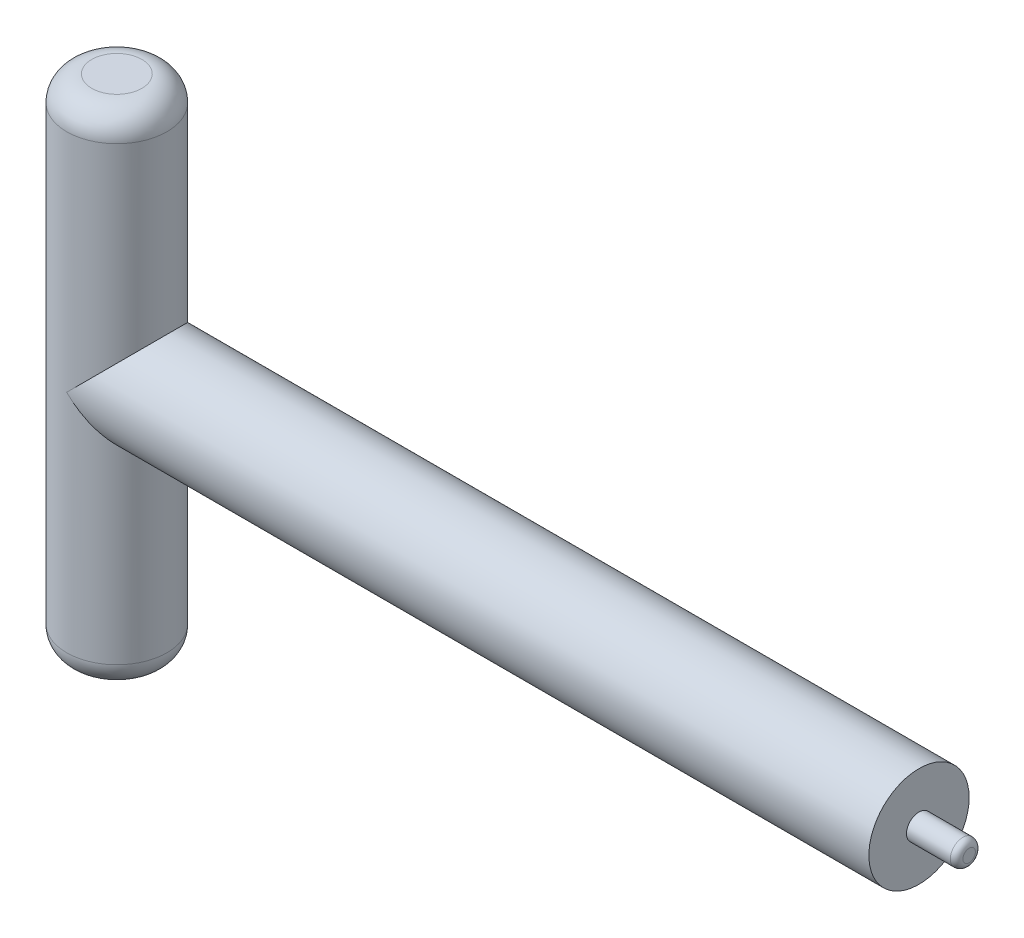
ISO-10303-21;
HEADER;
FILE_DESCRIPTION(('STEP AP214'),'2;1');
FILE_NAME('part.step','',(''),(''),'','','');
FILE_SCHEMA(('AUTOMOTIVE_DESIGN { 1 0 10303 214 1 1 1 1 }'));
ENDSEC;
DATA;
#1=APPLICATION_CONTEXT('core data for automotive mechanical design processes');
#2=APPLICATION_PROTOCOL_DEFINITION('international standard','automotive_design',2000,#1);
#3=PRODUCT_CONTEXT('',#1,'mechanical');
#4=PRODUCT('Part','Part','',(#3));
#5=PRODUCT_RELATED_PRODUCT_CATEGORY('part','',(#4));
#6=PRODUCT_DEFINITION_FORMATION('','',#4);
#7=PRODUCT_DEFINITION_CONTEXT('part definition',#1,'design');
#8=PRODUCT_DEFINITION('design','',#6,#7);
#9=PRODUCT_DEFINITION_SHAPE('','',#8);
#10=(LENGTH_UNIT() NAMED_UNIT(*) SI_UNIT(.MILLI.,.METRE.));
#11=(NAMED_UNIT(*) PLANE_ANGLE_UNIT() SI_UNIT($,.RADIAN.));
#12=(NAMED_UNIT(*) SI_UNIT($,.STERADIAN.) SOLID_ANGLE_UNIT());
#13=UNCERTAINTY_MEASURE_WITH_UNIT(LENGTH_MEASURE(1.E-05),#10,'distance_accuracy_value','');
#14=(GEOMETRIC_REPRESENTATION_CONTEXT(3) GLOBAL_UNCERTAINTY_ASSIGNED_CONTEXT((#13)) GLOBAL_UNIT_ASSIGNED_CONTEXT((#10,
#11,#12)) REPRESENTATION_CONTEXT('',''));
#15=CARTESIAN_POINT('',(0.,0.,0.));
#16=DIRECTION('',(0.,0.,1.));
#17=DIRECTION('',(1.,0.,0.));
#18=AXIS2_PLACEMENT_3D('',#15,#16,#17);
#19=CARTESIAN_POINT('',(203.2,0.,0.));
#20=DIRECTION('',(-1.,0.,0.));
#21=DIRECTION('',(0.,0.,1.));
#22=AXIS2_PLACEMENT_3D('',#19,#20,#21);
#23=CYLINDRICAL_SURFACE('',#22,12.7);
#24=CARTESIAN_POINT('',(203.2,0.,0.));
#25=DIRECTION('',(1.,0.,0.));
#26=DIRECTION('',(0.,0.,-1.));
#27=AXIS2_PLACEMENT_3D('',#24,#25,#26);
#28=CIRCLE('',#27,12.7);
#29=CARTESIAN_POINT('',(203.2,0.,-12.7));
#30=VERTEX_POINT('',#29);
#31=EDGE_CURVE('E59',#30,#30,#28,.T.);
#32=ORIENTED_EDGE('',*,*,#31,.F.);
#33=EDGE_LOOP('',(#32));
#34=FACE_BOUND('',#33,.T.);
#35=CARTESIAN_POINT('',(0.,0.,0.));
#36=DIRECTION('',(-0.707106781186547,-0.707106781186547,0.));
#37=DIRECTION('',(-0.707106781186547,0.707106781186547,0.));
#38=AXIS2_PLACEMENT_3D('',#35,#36,#37);
#39=ELLIPSE('',#38,17.9605122421383,12.7);
#40=CARTESIAN_POINT('',(0.,0.,12.7));
#41=VERTEX_POINT('',#40);
#42=CARTESIAN_POINT('',(0.,0.,-12.7));
#43=VERTEX_POINT('',#42);
#44=EDGE_CURVE('E55',#41,#43,#39,.F.);
#45=ORIENTED_EDGE('',*,*,#44,.T.);
#46=CARTESIAN_POINT('',(0.,0.,0.));
#47=DIRECTION('',(-0.707106781186547,0.707106781186547,0.));
#48=DIRECTION('',(-0.707106781186547,-0.707106781186547,0.));
#49=AXIS2_PLACEMENT_3D('',#46,#47,#48);
#50=ELLIPSE('',#49,17.9605122421383,12.7);
#51=EDGE_CURVE('E53',#43,#41,#50,.F.);
#52=ORIENTED_EDGE('',*,*,#51,.T.);
#53=EDGE_LOOP('',(#45,#52));
#54=FACE_BOUND('',#53,.T.);
#55=ADVANCED_FACE('F39',(#34,#54),#23,.T.);
#56=CARTESIAN_POINT('',(203.2,0.,0.));
#57=DIRECTION('',(1.,0.,0.));
#58=DIRECTION('',(0.,0.,-1.));
#59=AXIS2_PLACEMENT_3D('',#56,#57,#58);
#60=PLANE('',#59);
#61=CARTESIAN_POINT('',(203.2,0.,0.));
#62=DIRECTION('',(1.,0.,0.));
#63=DIRECTION('',(0.,0.,-1.));
#64=AXIS2_PLACEMENT_3D('',#61,#62,#63);
#65=CIRCLE('',#64,3.175);
#66=CARTESIAN_POINT('',(203.2,0.,-3.175));
#67=VERTEX_POINT('',#66);
#68=EDGE_CURVE('E62',#67,#67,#65,.T.);
#69=ORIENTED_EDGE('',*,*,#68,.F.);
#70=EDGE_LOOP('',(#69));
#71=FACE_BOUND('',#70,.T.);
#72=ORIENTED_EDGE('',*,*,#31,.T.);
#73=EDGE_LOOP('',(#72));
#74=FACE_BOUND('',#73,.T.);
#75=ADVANCED_FACE('F98',(#71,#74),#60,.T.);
#76=CARTESIAN_POINT('',(215.9,0.,0.));
#77=DIRECTION('',(-1.,0.,0.));
#78=DIRECTION('',(0.,0.,1.));
#79=AXIS2_PLACEMENT_3D('',#76,#77,#78);
#80=CYLINDRICAL_SURFACE('',#79,3.175);
#81=CARTESIAN_POINT('',(214.3125,0.,0.));
#82=DIRECTION('',(1.,0.,0.));
#83=DIRECTION('',(0.,0.,-1.));
#84=AXIS2_PLACEMENT_3D('',#81,#82,#83);
#85=CIRCLE('',#84,3.175);
#86=CARTESIAN_POINT('',(214.3125,0.,-3.175));
#87=VERTEX_POINT('',#86);
#88=EDGE_CURVE('E70',#87,#87,#85,.F.);
#89=ORIENTED_EDGE('',*,*,#88,.T.);
#90=EDGE_LOOP('',(#89));
#91=FACE_BOUND('',#90,.T.);
#92=ORIENTED_EDGE('',*,*,#68,.T.);
#93=EDGE_LOOP('',(#92));
#94=FACE_BOUND('',#93,.T.);
#95=ADVANCED_FACE('F106',(#91,#94),#80,.T.);
#96=CARTESIAN_POINT('',(215.9,0.,0.));
#97=DIRECTION('',(1.,0.,0.));
#98=DIRECTION('',(0.,0.,-1.));
#99=AXIS2_PLACEMENT_3D('',#96,#97,#98);
#100=PLANE('',#99);
#101=CARTESIAN_POINT('',(215.9,0.,0.));
#102=DIRECTION('',(1.,0.,0.));
#103=DIRECTION('',(0.,0.,-1.));
#104=AXIS2_PLACEMENT_3D('',#101,#102,#103);
#105=CIRCLE('',#104,1.5875);
#106=CARTESIAN_POINT('',(215.9,0.,-1.5875));
#107=VERTEX_POINT('',#106);
#108=EDGE_CURVE('E66',#107,#107,#105,.T.);
#109=ORIENTED_EDGE('',*,*,#108,.T.);
#110=EDGE_LOOP('',(#109));
#111=FACE_BOUND('',#110,.T.);
#112=ADVANCED_FACE('F113',(#111),#100,.T.);
#113=CARTESIAN_POINT('',(214.3125,0.,0.));
#114=DIRECTION('',(1.,0.,0.));
#115=DIRECTION('',(0.,0.,-1.));
#116=AXIS2_PLACEMENT_3D('',#113,#114,#115);
#117=DEGENERATE_TOROIDAL_SURFACE('',#116,1.5875,1.5875,.T.);
#118=ORIENTED_EDGE('',*,*,#88,.F.);
#119=EDGE_LOOP('',(#118));
#120=FACE_BOUND('',#119,.T.);
#121=ORIENTED_EDGE('',*,*,#108,.F.);
#122=EDGE_LOOP('',(#121));
#123=FACE_BOUND('',#122,.T.);
#124=ADVANCED_FACE('F112',(#120,#123),#117,.T.);
#125=CARTESIAN_POINT('',(0.,-63.5,0.));
#126=DIRECTION('',(0.,1.,0.));
#127=DIRECTION('',(0.,0.,1.));
#128=AXIS2_PLACEMENT_3D('',#125,#126,#127);
#129=CYLINDRICAL_SURFACE('',#128,12.7);
#130=CARTESIAN_POINT('',(0.,57.15,0.));
#131=DIRECTION('',(0.,1.,0.));
#132=DIRECTION('',(0.,0.,1.));
#133=AXIS2_PLACEMENT_3D('',#130,#131,#132);
#134=CIRCLE('',#133,12.7);
#135=CARTESIAN_POINT('',(0.,57.15,12.7));
#136=VERTEX_POINT('',#135);
#137=EDGE_CURVE('E47',#136,#136,#134,.F.);
#138=ORIENTED_EDGE('',*,*,#137,.T.);
#139=EDGE_LOOP('',(#138));
#140=FACE_BOUND('',#139,.T.);
#141=CARTESIAN_POINT('',(0.,-57.15,0.));
#142=DIRECTION('',(0.,1.,0.));
#143=DIRECTION('',(0.,0.,1.));
#144=AXIS2_PLACEMENT_3D('',#141,#142,#143);
#145=CIRCLE('',#144,12.7);
#146=CARTESIAN_POINT('',(0.,-57.15,12.7));
#147=VERTEX_POINT('',#146);
#148=EDGE_CURVE('E76',#147,#147,#145,.T.);
#149=ORIENTED_EDGE('',*,*,#148,.T.);
#150=EDGE_LOOP('',(#149));
#151=FACE_BOUND('',#150,.T.);
#152=ORIENTED_EDGE('',*,*,#51,.F.);
#153=ORIENTED_EDGE('',*,*,#44,.F.);
#154=EDGE_LOOP('',(#152,#153));
#155=FACE_BOUND('',#154,.T.);
#156=ADVANCED_FACE('F56',(#140,#151,#155),#129,.T.);
#157=CARTESIAN_POINT('',(0.,-63.5,0.));
#158=DIRECTION('',(0.,1.,0.));
#159=DIRECTION('',(0.,0.,1.));
#160=AXIS2_PLACEMENT_3D('',#157,#158,#159);
#161=PLANE('',#160);
#162=CARTESIAN_POINT('',(0.,-63.5,0.));
#163=DIRECTION('',(0.,1.,0.));
#164=DIRECTION('',(0.,0.,1.));
#165=AXIS2_PLACEMENT_3D('',#162,#163,#164);
#166=CIRCLE('',#165,6.35);
#167=CARTESIAN_POINT('',(0.,-63.5,6.35));
#168=VERTEX_POINT('',#167);
#169=EDGE_CURVE('E11',#168,#168,#166,.F.);
#170=ORIENTED_EDGE('',*,*,#169,.T.);
#171=EDGE_LOOP('',(#170));
#172=FACE_BOUND('',#171,.T.);
#173=ADVANCED_FACE('F90',(#172),#161,.F.);
#174=CARTESIAN_POINT('',(0.,63.5,0.));
#175=DIRECTION('',(0.,1.,0.));
#176=DIRECTION('',(0.,0.,1.));
#177=AXIS2_PLACEMENT_3D('',#174,#175,#176);
#178=PLANE('',#177);
#179=CARTESIAN_POINT('',(0.,63.5,0.));
#180=DIRECTION('',(0.,1.,0.));
#181=DIRECTION('',(0.,0.,1.));
#182=AXIS2_PLACEMENT_3D('',#179,#180,#181);
#183=CIRCLE('',#182,6.35);
#184=CARTESIAN_POINT('',(0.,63.5,6.35));
#185=VERTEX_POINT('',#184);
#186=EDGE_CURVE('E73',#185,#185,#183,.T.);
#187=ORIENTED_EDGE('',*,*,#186,.T.);
#188=EDGE_LOOP('',(#187));
#189=FACE_BOUND('',#188,.T.);
#190=ADVANCED_FACE('F86',(#189),#178,.T.);
#191=CARTESIAN_POINT('',(0.,57.15,0.));
#192=DIRECTION('',(0.,1.,0.));
#193=DIRECTION('',(0.,0.,1.));
#194=AXIS2_PLACEMENT_3D('',#191,#192,#193);
#195=DEGENERATE_TOROIDAL_SURFACE('',#194,6.35,6.35,.T.);
#196=ORIENTED_EDGE('',*,*,#137,.F.);
#197=EDGE_LOOP('',(#196));
#198=FACE_BOUND('',#197,.T.);
#199=ORIENTED_EDGE('',*,*,#186,.F.);
#200=EDGE_LOOP('',(#199));
#201=FACE_BOUND('',#200,.T.);
#202=ADVANCED_FACE('F83',(#198,#201),#195,.T.);
#203=CARTESIAN_POINT('',(0.,-57.15,0.));
#204=DIRECTION('',(0.,1.,0.));
#205=DIRECTION('',(0.,0.,1.));
#206=AXIS2_PLACEMENT_3D('',#203,#204,#205);
#207=DEGENERATE_TOROIDAL_SURFACE('',#206,6.35,6.35,.T.);
#208=ORIENTED_EDGE('',*,*,#169,.F.);
#209=EDGE_LOOP('',(#208));
#210=FACE_BOUND('',#209,.T.);
#211=ORIENTED_EDGE('',*,*,#148,.F.);
#212=EDGE_LOOP('',(#211));
#213=FACE_BOUND('',#212,.T.);
#214=ADVANCED_FACE('F41',(#210,#213),#207,.T.);
#215=CLOSED_SHELL('',(#55,#75,#95,#112,#124,#156,#173,#190,#202,#214));
#216=MANIFOLD_SOLID_BREP('B2',#215);
#217=ADVANCED_BREP_SHAPE_REPRESENTATION('',(#18,#216),#14);
#218=SHAPE_DEFINITION_REPRESENTATION(#9,#217);
ENDSEC;
END-ISO-10303-21;
